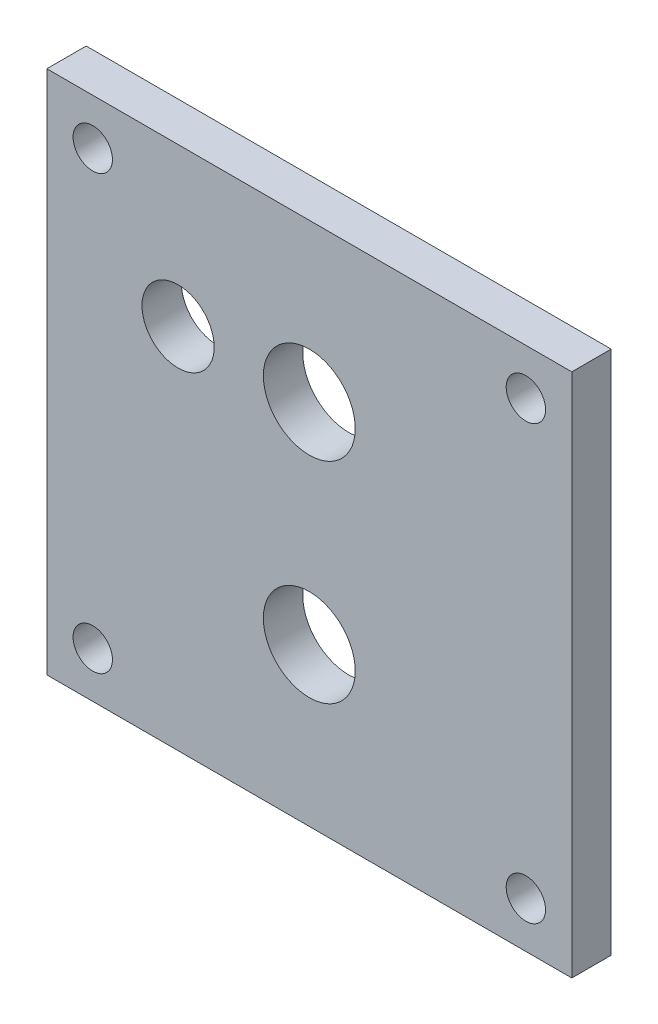
ISO-10303-21;
HEADER;
FILE_DESCRIPTION(('STEP AP214'),'2;1');
FILE_NAME('part.step','',(''),(''),'','','');
FILE_SCHEMA(('AUTOMOTIVE_DESIGN { 1 0 10303 214 1 1 1 1 }'));
ENDSEC;
DATA;
#1=APPLICATION_CONTEXT('core data for automotive mechanical design processes');
#2=APPLICATION_PROTOCOL_DEFINITION('international standard','automotive_design',2000,#1);
#3=PRODUCT_CONTEXT('',#1,'mechanical');
#4=PRODUCT('Part','Part','',(#3));
#5=PRODUCT_RELATED_PRODUCT_CATEGORY('part','',(#4));
#6=PRODUCT_DEFINITION_FORMATION('','',#4);
#7=PRODUCT_DEFINITION_CONTEXT('part definition',#1,'design');
#8=PRODUCT_DEFINITION('design','',#6,#7);
#9=PRODUCT_DEFINITION_SHAPE('','',#8);
#10=(LENGTH_UNIT() NAMED_UNIT(*) SI_UNIT(.MILLI.,.METRE.));
#11=(NAMED_UNIT(*) PLANE_ANGLE_UNIT() SI_UNIT($,.RADIAN.));
#12=(NAMED_UNIT(*) SI_UNIT($,.STERADIAN.) SOLID_ANGLE_UNIT());
#13=UNCERTAINTY_MEASURE_WITH_UNIT(LENGTH_MEASURE(1.E-05),#10,'distance_accuracy_value','');
#14=(GEOMETRIC_REPRESENTATION_CONTEXT(3) GLOBAL_UNCERTAINTY_ASSIGNED_CONTEXT((#13)) GLOBAL_UNIT_ASSIGNED_CONTEXT((#10,
#11,#12)) REPRESENTATION_CONTEXT('',''));
#15=CARTESIAN_POINT('',(0.,0.,0.));
#16=DIRECTION('',(0.,0.,1.));
#17=DIRECTION('',(1.,0.,0.));
#18=AXIS2_PLACEMENT_3D('',#15,#16,#17);
#19=CARTESIAN_POINT('',(63.5,63.5,9.525));
#20=DIRECTION('',(-1.,0.,0.));
#21=DIRECTION('',(0.,-1.,0.));
#22=AXIS2_PLACEMENT_3D('',#19,#20,#21);
#23=PLANE('',#22);
#24=DIRECTION('',(0.,1.,0.));
#25=VECTOR('',#24,1.);
#26=CARTESIAN_POINT('',(63.5,63.5,0.));
#27=LINE('',#26,#25);
#28=CARTESIAN_POINT('',(63.5,-63.5,0.));
#29=VERTEX_POINT('',#28);
#30=CARTESIAN_POINT('',(63.5,63.5,0.));
#31=VERTEX_POINT('',#30);
#32=EDGE_CURVE('E95',#29,#31,#27,.T.);
#33=ORIENTED_EDGE('',*,*,#32,.T.);
#34=DIRECTION('',(0.,0.,-1.));
#35=VECTOR('',#34,1.);
#36=CARTESIAN_POINT('',(63.5,63.5,9.525));
#37=LINE('',#36,#35);
#38=CARTESIAN_POINT('',(63.5,63.5,9.525));
#39=VERTEX_POINT('',#38);
#40=EDGE_CURVE('E11',#39,#31,#37,.T.);
#41=ORIENTED_EDGE('',*,*,#40,.F.);
#42=DIRECTION('',(0.,1.,0.));
#43=VECTOR('',#42,1.);
#44=CARTESIAN_POINT('',(63.5,63.5,9.525));
#45=LINE('',#44,#43);
#46=CARTESIAN_POINT('',(63.5,-63.5,9.525));
#47=VERTEX_POINT('',#46);
#48=EDGE_CURVE('E83',#47,#39,#45,.T.);
#49=ORIENTED_EDGE('',*,*,#48,.F.);
#50=DIRECTION('',(0.,0.,-1.));
#51=VECTOR('',#50,1.);
#52=CARTESIAN_POINT('',(63.5,-63.5,9.525));
#53=LINE('',#52,#51);
#54=EDGE_CURVE('E91',#47,#29,#53,.T.);
#55=ORIENTED_EDGE('',*,*,#54,.T.);
#56=EDGE_LOOP('',(#33,#41,#49,#55));
#57=FACE_BOUND('',#56,.T.);
#58=ADVANCED_FACE('F32',(#57),#23,.F.);
#59=CARTESIAN_POINT('',(-63.5,63.5,9.525));
#60=DIRECTION('',(0.,-1.,0.));
#61=DIRECTION('',(0.,0.,-1.));
#62=AXIS2_PLACEMENT_3D('',#59,#60,#61);
#63=PLANE('',#62);
#64=DIRECTION('',(-1.,0.,0.));
#65=VECTOR('',#64,1.);
#66=CARTESIAN_POINT('',(-63.5,63.5,0.));
#67=LINE('',#66,#65);
#68=CARTESIAN_POINT('',(-63.5,63.5,0.));
#69=VERTEX_POINT('',#68);
#70=EDGE_CURVE('E87',#31,#69,#67,.T.);
#71=ORIENTED_EDGE('',*,*,#70,.T.);
#72=DIRECTION('',(0.,0.,-1.));
#73=VECTOR('',#72,1.);
#74=CARTESIAN_POINT('',(-63.5,63.5,9.525));
#75=LINE('',#74,#73);
#76=CARTESIAN_POINT('',(-63.5,63.5,9.525));
#77=VERTEX_POINT('',#76);
#78=EDGE_CURVE('E40',#77,#69,#75,.T.);
#79=ORIENTED_EDGE('',*,*,#78,.F.);
#80=DIRECTION('',(-1.,0.,0.));
#81=VECTOR('',#80,1.);
#82=CARTESIAN_POINT('',(-63.5,63.5,9.525));
#83=LINE('',#82,#81);
#84=EDGE_CURVE('E78',#39,#77,#83,.T.);
#85=ORIENTED_EDGE('',*,*,#84,.F.);
#86=ORIENTED_EDGE('',*,*,#40,.T.);
#87=EDGE_LOOP('',(#71,#79,#85,#86));
#88=FACE_BOUND('',#87,.T.);
#89=ADVANCED_FACE('F86',(#88),#63,.F.);
#90=CARTESIAN_POINT('',(-63.5,63.5,9.525));
#91=DIRECTION('',(1.,0.,0.));
#92=DIRECTION('',(0.,1.,0.));
#93=AXIS2_PLACEMENT_3D('',#90,#91,#92);
#94=PLANE('',#93);
#95=DIRECTION('',(0.,-1.,0.));
#96=VECTOR('',#95,1.);
#97=CARTESIAN_POINT('',(-63.5,63.5,0.));
#98=LINE('',#97,#96);
#99=CARTESIAN_POINT('',(-63.5,-63.5,0.));
#100=VERTEX_POINT('',#99);
#101=EDGE_CURVE('E65',#69,#100,#98,.T.);
#102=ORIENTED_EDGE('',*,*,#101,.T.);
#103=DIRECTION('',(0.,0.,-1.));
#104=VECTOR('',#103,1.);
#105=CARTESIAN_POINT('',(-63.5,-63.5,9.525));
#106=LINE('',#105,#104);
#107=CARTESIAN_POINT('',(-63.5,-63.5,9.525));
#108=VERTEX_POINT('',#107);
#109=EDGE_CURVE('E88',#108,#100,#106,.T.);
#110=ORIENTED_EDGE('',*,*,#109,.F.);
#111=DIRECTION('',(0.,-1.,0.));
#112=VECTOR('',#111,1.);
#113=CARTESIAN_POINT('',(-63.5,63.5,9.525));
#114=LINE('',#113,#112);
#115=EDGE_CURVE('E81',#77,#108,#114,.T.);
#116=ORIENTED_EDGE('',*,*,#115,.F.);
#117=ORIENTED_EDGE('',*,*,#78,.T.);
#118=EDGE_LOOP('',(#102,#110,#116,#117));
#119=FACE_BOUND('',#118,.T.);
#120=ADVANCED_FACE('F89',(#119),#94,.F.);
#121=CARTESIAN_POINT('',(-63.5,-63.5,9.525));
#122=DIRECTION('',(0.,1.,0.));
#123=DIRECTION('',(0.,0.,1.));
#124=AXIS2_PLACEMENT_3D('',#121,#122,#123);
#125=PLANE('',#124);
#126=DIRECTION('',(1.,0.,0.));
#127=VECTOR('',#126,1.);
#128=CARTESIAN_POINT('',(-63.5,-63.5,0.));
#129=LINE('',#128,#127);
#130=EDGE_CURVE('E71',#100,#29,#129,.T.);
#131=ORIENTED_EDGE('',*,*,#130,.T.);
#132=ORIENTED_EDGE('',*,*,#54,.F.);
#133=DIRECTION('',(1.,0.,0.));
#134=VECTOR('',#133,1.);
#135=CARTESIAN_POINT('',(-63.5,-63.5,9.525));
#136=LINE('',#135,#134);
#137=EDGE_CURVE('E48',#108,#47,#136,.T.);
#138=ORIENTED_EDGE('',*,*,#137,.F.);
#139=ORIENTED_EDGE('',*,*,#109,.T.);
#140=EDGE_LOOP('',(#131,#132,#138,#139));
#141=FACE_BOUND('',#140,.T.);
#142=ADVANCED_FACE('F103',(#141),#125,.F.);
#143=CARTESIAN_POINT('',(0.,0.,9.525));
#144=DIRECTION('',(0.,0.,1.));
#145=DIRECTION('',(1.,0.,0.));
#146=AXIS2_PLACEMENT_3D('',#143,#144,#145);
#147=PLANE('',#146);
#148=CARTESIAN_POINT('',(52.3875,-52.3875,9.525));
#149=DIRECTION('',(0.,0.,1.));
#150=DIRECTION('',(1.,0.,0.));
#151=AXIS2_PLACEMENT_3D('',#148,#149,#150);
#152=CIRCLE('',#151,4.7625);
#153=CARTESIAN_POINT('',(47.625,-52.3875,9.525));
#154=VERTEX_POINT('',#153);
#155=EDGE_CURVE('E144',#154,#154,#152,.F.);
#156=ORIENTED_EDGE('',*,*,#155,.T.);
#157=EDGE_LOOP('',(#156));
#158=FACE_BOUND('',#157,.T.);
#159=CARTESIAN_POINT('',(52.3875,52.3875,9.525));
#160=DIRECTION('',(0.,0.,1.));
#161=DIRECTION('',(1.,0.,0.));
#162=AXIS2_PLACEMENT_3D('',#159,#160,#161);
#163=CIRCLE('',#162,4.7625);
#164=CARTESIAN_POINT('',(47.625,52.3875,9.525));
#165=VERTEX_POINT('',#164);
#166=EDGE_CURVE('E138',#165,#165,#163,.F.);
#167=ORIENTED_EDGE('',*,*,#166,.T.);
#168=EDGE_LOOP('',(#167));
#169=FACE_BOUND('',#168,.T.);
#170=CARTESIAN_POINT('',(-52.3875,-52.3875,9.525));
#171=DIRECTION('',(0.,0.,1.));
#172=DIRECTION('',(1.,0.,0.));
#173=AXIS2_PLACEMENT_3D('',#170,#171,#172);
#174=CIRCLE('',#173,4.7625);
#175=CARTESIAN_POINT('',(-57.15,-52.3875,9.525));
#176=VERTEX_POINT('',#175);
#177=EDGE_CURVE('E132',#176,#176,#174,.F.);
#178=ORIENTED_EDGE('',*,*,#177,.T.);
#179=EDGE_LOOP('',(#178));
#180=FACE_BOUND('',#179,.T.);
#181=CARTESIAN_POINT('',(-52.3875,52.3875,9.525));
#182=DIRECTION('',(0.,0.,1.));
#183=DIRECTION('',(1.,0.,0.));
#184=AXIS2_PLACEMENT_3D('',#181,#182,#183);
#185=CIRCLE('',#184,4.7625);
#186=CARTESIAN_POINT('',(-57.15,52.3875,9.525));
#187=VERTEX_POINT('',#186);
#188=EDGE_CURVE('E126',#187,#187,#185,.F.);
#189=ORIENTED_EDGE('',*,*,#188,.T.);
#190=EDGE_LOOP('',(#189));
#191=FACE_BOUND('',#190,.T.);
#192=CARTESIAN_POINT('',(0.,-25.4,9.525));
#193=DIRECTION('',(0.,0.,1.));
#194=DIRECTION('',(1.,0.,0.));
#195=AXIS2_PLACEMENT_3D('',#192,#193,#194);
#196=CIRCLE('',#195,11.1125);
#197=CARTESIAN_POINT('',(11.1125,-25.4,9.525));
#198=VERTEX_POINT('',#197);
#199=EDGE_CURVE('E120',#198,#198,#196,.F.);
#200=ORIENTED_EDGE('',*,*,#199,.T.);
#201=EDGE_LOOP('',(#200));
#202=FACE_BOUND('',#201,.T.);
#203=CARTESIAN_POINT('',(-31.75,25.4,9.525));
#204=DIRECTION('',(0.,0.,1.));
#205=DIRECTION('',(1.,0.,0.));
#206=AXIS2_PLACEMENT_3D('',#203,#204,#205);
#207=CIRCLE('',#206,8.73124999999999);
#208=CARTESIAN_POINT('',(-23.01875,25.4,9.525));
#209=VERTEX_POINT('',#208);
#210=EDGE_CURVE('E114',#209,#209,#207,.F.);
#211=ORIENTED_EDGE('',*,*,#210,.T.);
#212=EDGE_LOOP('',(#211));
#213=FACE_BOUND('',#212,.T.);
#214=CARTESIAN_POINT('',(0.,25.4,9.525));
#215=DIRECTION('',(0.,0.,1.));
#216=DIRECTION('',(1.,0.,0.));
#217=AXIS2_PLACEMENT_3D('',#214,#215,#216);
#218=CIRCLE('',#217,11.1125);
#219=CARTESIAN_POINT('',(11.1125,25.4,9.525));
#220=VERTEX_POINT('',#219);
#221=EDGE_CURVE('E98',#220,#220,#218,.F.);
#222=ORIENTED_EDGE('',*,*,#221,.T.);
#223=EDGE_LOOP('',(#222));
#224=FACE_BOUND('',#223,.T.);
#225=ORIENTED_EDGE('',*,*,#48,.T.);
#226=ORIENTED_EDGE('',*,*,#84,.T.);
#227=ORIENTED_EDGE('',*,*,#115,.T.);
#228=ORIENTED_EDGE('',*,*,#137,.T.);
#229=EDGE_LOOP('',(#225,#226,#227,#228));
#230=FACE_BOUND('',#229,.T.);
#231=ADVANCED_FACE('F79',(#158,#169,#180,#191,#202,#213,#224,#230),#147,.T.);
#232=CARTESIAN_POINT('',(0.,0.,0.));
#233=DIRECTION('',(0.,0.,1.));
#234=DIRECTION('',(1.,0.,0.));
#235=AXIS2_PLACEMENT_3D('',#232,#233,#234);
#236=PLANE('',#235);
#237=CARTESIAN_POINT('',(52.3875,-52.3875,0.));
#238=DIRECTION('',(0.,0.,-1.));
#239=DIRECTION('',(-1.,0.,0.));
#240=AXIS2_PLACEMENT_3D('',#237,#238,#239);
#241=CIRCLE('',#240,4.7625);
#242=CARTESIAN_POINT('',(47.625,-52.3875,0.));
#243=VERTEX_POINT('',#242);
#244=EDGE_CURVE('E147',#243,#243,#241,.T.);
#245=ORIENTED_EDGE('',*,*,#244,.F.);
#246=EDGE_LOOP('',(#245));
#247=FACE_BOUND('',#246,.T.);
#248=CARTESIAN_POINT('',(52.3875,52.3875,0.));
#249=DIRECTION('',(0.,0.,-1.));
#250=DIRECTION('',(1.,0.,0.));
#251=AXIS2_PLACEMENT_3D('',#248,#249,#250);
#252=CIRCLE('',#251,4.7625);
#253=CARTESIAN_POINT('',(47.625,52.3875,0.));
#254=VERTEX_POINT('',#253);
#255=EDGE_CURVE('E141',#254,#254,#252,.T.);
#256=ORIENTED_EDGE('',*,*,#255,.F.);
#257=EDGE_LOOP('',(#256));
#258=FACE_BOUND('',#257,.T.);
#259=CARTESIAN_POINT('',(-52.3875,-52.3875,0.));
#260=DIRECTION('',(0.,0.,-1.));
#261=DIRECTION('',(1.,0.,0.));
#262=AXIS2_PLACEMENT_3D('',#259,#260,#261);
#263=CIRCLE('',#262,4.7625);
#264=CARTESIAN_POINT('',(-57.15,-52.3875,0.));
#265=VERTEX_POINT('',#264);
#266=EDGE_CURVE('E135',#265,#265,#263,.T.);
#267=ORIENTED_EDGE('',*,*,#266,.F.);
#268=EDGE_LOOP('',(#267));
#269=FACE_BOUND('',#268,.T.);
#270=CARTESIAN_POINT('',(-52.3875,52.3875,0.));
#271=DIRECTION('',(0.,0.,-1.));
#272=DIRECTION('',(-1.,0.,0.));
#273=AXIS2_PLACEMENT_3D('',#270,#271,#272);
#274=CIRCLE('',#273,4.7625);
#275=CARTESIAN_POINT('',(-57.15,52.3875,0.));
#276=VERTEX_POINT('',#275);
#277=EDGE_CURVE('E129',#276,#276,#274,.T.);
#278=ORIENTED_EDGE('',*,*,#277,.F.);
#279=EDGE_LOOP('',(#278));
#280=FACE_BOUND('',#279,.T.);
#281=CARTESIAN_POINT('',(0.,-25.4,0.));
#282=DIRECTION('',(0.,0.,-1.));
#283=DIRECTION('',(-1.,0.,0.));
#284=AXIS2_PLACEMENT_3D('',#281,#282,#283);
#285=CIRCLE('',#284,11.1125);
#286=CARTESIAN_POINT('',(-11.1125,-25.4,0.));
#287=VERTEX_POINT('',#286);
#288=EDGE_CURVE('E123',#287,#287,#285,.T.);
#289=ORIENTED_EDGE('',*,*,#288,.F.);
#290=EDGE_LOOP('',(#289));
#291=FACE_BOUND('',#290,.T.);
#292=CARTESIAN_POINT('',(-31.75,25.4,0.));
#293=DIRECTION('',(0.,0.,-1.));
#294=DIRECTION('',(-1.,0.,0.));
#295=AXIS2_PLACEMENT_3D('',#292,#293,#294);
#296=CIRCLE('',#295,8.73124999999999);
#297=CARTESIAN_POINT('',(-40.48125,25.4,0.));
#298=VERTEX_POINT('',#297);
#299=EDGE_CURVE('E117',#298,#298,#296,.T.);
#300=ORIENTED_EDGE('',*,*,#299,.F.);
#301=EDGE_LOOP('',(#300));
#302=FACE_BOUND('',#301,.T.);
#303=CARTESIAN_POINT('',(0.,25.4,0.));
#304=DIRECTION('',(0.,0.,-1.));
#305=DIRECTION('',(-1.,0.,0.));
#306=AXIS2_PLACEMENT_3D('',#303,#304,#305);
#307=CIRCLE('',#306,11.1125);
#308=CARTESIAN_POINT('',(-11.1125,25.4,0.));
#309=VERTEX_POINT('',#308);
#310=EDGE_CURVE('E111',#309,#309,#307,.T.);
#311=ORIENTED_EDGE('',*,*,#310,.F.);
#312=EDGE_LOOP('',(#311));
#313=FACE_BOUND('',#312,.T.);
#314=ORIENTED_EDGE('',*,*,#32,.F.);
#315=ORIENTED_EDGE('',*,*,#130,.F.);
#316=ORIENTED_EDGE('',*,*,#101,.F.);
#317=ORIENTED_EDGE('',*,*,#70,.F.);
#318=EDGE_LOOP('',(#314,#315,#316,#317));
#319=FACE_BOUND('',#318,.T.);
#320=ADVANCED_FACE('F106',(#247,#258,#269,#280,#291,#302,#313,#319),#236,.F.);
#321=CARTESIAN_POINT('',(0.,25.4,40.955896423742));
#322=DIRECTION('',(0.,0.,-1.));
#323=DIRECTION('',(-1.,0.,0.));
#324=AXIS2_PLACEMENT_3D('',#321,#322,#323);
#325=CYLINDRICAL_SURFACE('',#324,11.1125);
#326=ORIENTED_EDGE('',*,*,#310,.T.);
#327=EDGE_LOOP('',(#326));
#328=FACE_BOUND('',#327,.T.);
#329=ORIENTED_EDGE('',*,*,#221,.F.);
#330=EDGE_LOOP('',(#329));
#331=FACE_BOUND('',#330,.T.);
#332=ADVANCED_FACE('F156',(#328,#331),#325,.F.);
#333=CARTESIAN_POINT('',(-31.75,25.4,40.955896423742));
#334=DIRECTION('',(0.,0.,-1.));
#335=DIRECTION('',(-1.,0.,0.));
#336=AXIS2_PLACEMENT_3D('',#333,#334,#335);
#337=CYLINDRICAL_SURFACE('',#336,8.73124999999999);
#338=ORIENTED_EDGE('',*,*,#299,.T.);
#339=EDGE_LOOP('',(#338));
#340=FACE_BOUND('',#339,.T.);
#341=ORIENTED_EDGE('',*,*,#210,.F.);
#342=EDGE_LOOP('',(#341));
#343=FACE_BOUND('',#342,.T.);
#344=ADVANCED_FACE('F172',(#340,#343),#337,.F.);
#345=CARTESIAN_POINT('',(0.,-25.4,40.955896423742));
#346=DIRECTION('',(0.,0.,-1.));
#347=DIRECTION('',(-1.,0.,0.));
#348=AXIS2_PLACEMENT_3D('',#345,#346,#347);
#349=CYLINDRICAL_SURFACE('',#348,11.1125);
#350=ORIENTED_EDGE('',*,*,#288,.T.);
#351=EDGE_LOOP('',(#350));
#352=FACE_BOUND('',#351,.T.);
#353=ORIENTED_EDGE('',*,*,#199,.F.);
#354=EDGE_LOOP('',(#353));
#355=FACE_BOUND('',#354,.T.);
#356=ADVANCED_FACE('F215',(#352,#355),#349,.F.);
#357=CARTESIAN_POINT('',(-52.3875,52.3875,22.9953841816037));
#358=DIRECTION('',(0.,0.,-1.));
#359=DIRECTION('',(-1.,0.,0.));
#360=AXIS2_PLACEMENT_3D('',#357,#358,#359);
#361=CYLINDRICAL_SURFACE('',#360,4.7625);
#362=CARTESIAN_POINT('',(-57.15,52.3875,0.));
#363=CARTESIAN_POINT('',(-57.15,52.3875,0.0992187500000035));
#364=CARTESIAN_POINT('',(-57.15,52.3875,0.198437500000004));
#365=CARTESIAN_POINT('',(-57.15,52.3875,0.396875000000004));
#366=CARTESIAN_POINT('',(-57.15,52.3875,0.496093750000004));
#367=CARTESIAN_POINT('',(-57.15,52.3875,0.694531250000004));
#368=CARTESIAN_POINT('',(-57.15,52.3875,0.793750000000004));
#369=CARTESIAN_POINT('',(-57.15,52.3875,0.992187500000004));
#370=CARTESIAN_POINT('',(-57.15,52.3875,1.09140625));
#371=CARTESIAN_POINT('',(-57.15,52.3875,1.28984375));
#372=CARTESIAN_POINT('',(-57.15,52.3875,1.3890625));
#373=CARTESIAN_POINT('',(-57.15,52.3875,1.5875));
#374=CARTESIAN_POINT('',(-57.15,52.3875,1.68671875));
#375=CARTESIAN_POINT('',(-57.15,52.3875,1.88515625));
#376=CARTESIAN_POINT('',(-57.15,52.3875,1.984375));
#377=CARTESIAN_POINT('',(-57.15,52.3875,2.1828125));
#378=CARTESIAN_POINT('',(-57.15,52.3875,2.28203125000001));
#379=CARTESIAN_POINT('',(-57.15,52.3875,2.48046875));
#380=CARTESIAN_POINT('',(-57.15,52.3875,2.57968750000001));
#381=CARTESIAN_POINT('',(-57.15,52.3875,2.778125));
#382=CARTESIAN_POINT('',(-57.15,52.3875,2.87734375));
#383=CARTESIAN_POINT('',(-57.15,52.3875,3.07578125));
#384=CARTESIAN_POINT('',(-57.15,52.3875,3.175));
#385=CARTESIAN_POINT('',(-57.15,52.3875,3.3734375));
#386=CARTESIAN_POINT('',(-57.15,52.3875,3.47265625));
#387=CARTESIAN_POINT('',(-57.15,52.3875,3.67109375));
#388=CARTESIAN_POINT('',(-57.15,52.3875,3.7703125));
#389=CARTESIAN_POINT('',(-57.15,52.3875,3.96875));
#390=CARTESIAN_POINT('',(-57.15,52.3875,4.06796875));
#391=CARTESIAN_POINT('',(-57.15,52.3875,4.26640625));
#392=CARTESIAN_POINT('',(-57.15,52.3875,4.365625));
#393=CARTESIAN_POINT('',(-57.15,52.3875,4.5640625));
#394=CARTESIAN_POINT('',(-57.15,52.3875,4.66328125));
#395=CARTESIAN_POINT('',(-57.15,52.3875,4.86171875));
#396=CARTESIAN_POINT('',(-57.15,52.3875,4.9609375));
#397=CARTESIAN_POINT('',(-57.15,52.3875,5.159375));
#398=CARTESIAN_POINT('',(-57.15,52.3875,5.25859375));
#399=CARTESIAN_POINT('',(-57.15,52.3875,5.45703125));
#400=CARTESIAN_POINT('',(-57.15,52.3875,5.55625));
#401=CARTESIAN_POINT('',(-57.15,52.3875,5.7546875));
#402=CARTESIAN_POINT('',(-57.15,52.3875,5.85390625));
#403=CARTESIAN_POINT('',(-57.15,52.3875,6.05234375));
#404=CARTESIAN_POINT('',(-57.15,52.3875,6.1515625));
#405=CARTESIAN_POINT('',(-57.15,52.3875,6.35));
#406=CARTESIAN_POINT('',(-57.15,52.3875,6.44921875));
#407=CARTESIAN_POINT('',(-57.15,52.3875,6.64765625));
#408=CARTESIAN_POINT('',(-57.15,52.3875,6.746875));
#409=CARTESIAN_POINT('',(-57.15,52.3875,6.9453125));
#410=CARTESIAN_POINT('',(-57.15,52.3875,7.04453125));
#411=CARTESIAN_POINT('',(-57.15,52.3875,7.24296875));
#412=CARTESIAN_POINT('',(-57.15,52.3875,7.3421875));
#413=CARTESIAN_POINT('',(-57.15,52.3875,7.540625));
#414=CARTESIAN_POINT('',(-57.15,52.3875,7.63984375));
#415=CARTESIAN_POINT('',(-57.15,52.3875,7.83828125));
#416=CARTESIAN_POINT('',(-57.15,52.3875,7.9375));
#417=CARTESIAN_POINT('',(-57.15,52.3875,8.1359375));
#418=CARTESIAN_POINT('',(-57.15,52.3875,8.23515625));
#419=CARTESIAN_POINT('',(-57.15,52.3875,8.43359375));
#420=CARTESIAN_POINT('',(-57.15,52.3875,8.5328125));
#421=CARTESIAN_POINT('',(-57.15,52.3875,8.73125));
#422=CARTESIAN_POINT('',(-57.15,52.3875,8.83046875));
#423=CARTESIAN_POINT('',(-57.15,52.3875,9.02890625));
#424=CARTESIAN_POINT('',(-57.15,52.3875,9.128125));
#425=CARTESIAN_POINT('',(-57.15,52.3875,9.3265625));
#426=CARTESIAN_POINT('',(-57.15,52.3875,9.42578125));
#427=CARTESIAN_POINT('',(-57.15,52.3875,9.525));
#428=B_SPLINE_CURVE_WITH_KNOTS('',3,(#362,#363,#364,#365,#366,#367,#368,#369,#370,#371,#372,
#373,#374,#375,#376,#377,#378,#379,#380,#381,#382,#383,#384,#385,#386,#387,#388,#389,#390,#391,
#392,#393,#394,#395,#396,#397,#398,#399,#400,#401,#402,#403,#404,#405,#406,#407,#408,#409,#410,
#411,#412,#413,#414,#415,#416,#417,#418,#419,#420,#421,#422,#423,#424,#425,#426,#427),
.UNSPECIFIED.,.F.,.F.,(4,2,2,2,2,2,2,2,2,2,2,2,2,2,2,2,2,2,2,2,2,2,2,2,2,2,2,2,2,2,2,2,4),(0.,
0.29765625,0.5953125,0.892968750000001,1.190625,1.48828125,1.7859375,2.08359375,2.38125,
2.67890625,2.9765625,3.27421875,3.571875,3.86953125,4.1671875,4.46484375,4.7625,5.06015625,
5.3578125,5.65546875,5.953125,6.25078125,6.5484375,6.84609375,7.14375,7.44140625,7.7390625,
8.03671875,8.334375,8.63203125,8.9296875,9.22734375,9.525),.UNSPECIFIED.);
#429=EDGE_CURVE('BSEAM224',#276,#187,#428,.T.);
#430=ORIENTED_EDGE('',*,*,#277,.T.);
#431=ORIENTED_EDGE('',*,*,#188,.F.);
#432=ORIENTED_EDGE('',*,*,#429,.T.);
#433=ORIENTED_EDGE('',*,*,#429,.F.);
#434=EDGE_LOOP('',(#430,#432,#431,#433));
#435=FACE_BOUND('',#434,.T.);
#436=ADVANCED_FACE('F224',(#435),#361,.F.);
#437=CARTESIAN_POINT('',(-52.3875,-52.3875,22.9953841816037));
#438=DIRECTION('',(0.,0.,-1.));
#439=DIRECTION('',(-1.,0.,0.));
#440=AXIS2_PLACEMENT_3D('',#437,#438,#439);
#441=CYLINDRICAL_SURFACE('',#440,4.7625);
#442=CARTESIAN_POINT('',(-57.15,-52.3875,0.));
#443=CARTESIAN_POINT('',(-57.15,-52.3875,0.0992187500000035));
#444=CARTESIAN_POINT('',(-57.15,-52.3875,0.198437500000004));
#445=CARTESIAN_POINT('',(-57.15,-52.3875,0.396875000000004));
#446=CARTESIAN_POINT('',(-57.15,-52.3875,0.496093750000004));
#447=CARTESIAN_POINT('',(-57.15,-52.3875,0.694531250000004));
#448=CARTESIAN_POINT('',(-57.15,-52.3875,0.793750000000004));
#449=CARTESIAN_POINT('',(-57.15,-52.3875,0.992187500000004));
#450=CARTESIAN_POINT('',(-57.15,-52.3875,1.09140625));
#451=CARTESIAN_POINT('',(-57.15,-52.3875,1.28984375));
#452=CARTESIAN_POINT('',(-57.15,-52.3875,1.3890625));
#453=CARTESIAN_POINT('',(-57.15,-52.3875,1.5875));
#454=CARTESIAN_POINT('',(-57.15,-52.3875,1.68671875));
#455=CARTESIAN_POINT('',(-57.15,-52.3875,1.88515625));
#456=CARTESIAN_POINT('',(-57.15,-52.3875,1.984375));
#457=CARTESIAN_POINT('',(-57.15,-52.3875,2.1828125));
#458=CARTESIAN_POINT('',(-57.15,-52.3875,2.28203125000001));
#459=CARTESIAN_POINT('',(-57.15,-52.3875,2.48046875));
#460=CARTESIAN_POINT('',(-57.15,-52.3875,2.57968750000001));
#461=CARTESIAN_POINT('',(-57.15,-52.3875,2.778125));
#462=CARTESIAN_POINT('',(-57.15,-52.3875,2.87734375));
#463=CARTESIAN_POINT('',(-57.15,-52.3875,3.07578125));
#464=CARTESIAN_POINT('',(-57.15,-52.3875,3.175));
#465=CARTESIAN_POINT('',(-57.15,-52.3875,3.3734375));
#466=CARTESIAN_POINT('',(-57.15,-52.3875,3.47265625));
#467=CARTESIAN_POINT('',(-57.15,-52.3875,3.67109375));
#468=CARTESIAN_POINT('',(-57.15,-52.3875,3.7703125));
#469=CARTESIAN_POINT('',(-57.15,-52.3875,3.96875));
#470=CARTESIAN_POINT('',(-57.15,-52.3875,4.06796875));
#471=CARTESIAN_POINT('',(-57.15,-52.3875,4.26640625));
#472=CARTESIAN_POINT('',(-57.15,-52.3875,4.365625));
#473=CARTESIAN_POINT('',(-57.15,-52.3875,4.5640625));
#474=CARTESIAN_POINT('',(-57.15,-52.3875,4.66328125));
#475=CARTESIAN_POINT('',(-57.15,-52.3875,4.86171875));
#476=CARTESIAN_POINT('',(-57.15,-52.3875,4.9609375));
#477=CARTESIAN_POINT('',(-57.15,-52.3875,5.159375));
#478=CARTESIAN_POINT('',(-57.15,-52.3875,5.25859375));
#479=CARTESIAN_POINT('',(-57.15,-52.3875,5.45703125));
#480=CARTESIAN_POINT('',(-57.15,-52.3875,5.55625));
#481=CARTESIAN_POINT('',(-57.15,-52.3875,5.7546875));
#482=CARTESIAN_POINT('',(-57.15,-52.3875,5.85390625));
#483=CARTESIAN_POINT('',(-57.15,-52.3875,6.05234375));
#484=CARTESIAN_POINT('',(-57.15,-52.3875,6.1515625));
#485=CARTESIAN_POINT('',(-57.15,-52.3875,6.35));
#486=CARTESIAN_POINT('',(-57.15,-52.3875,6.44921875));
#487=CARTESIAN_POINT('',(-57.15,-52.3875,6.64765625));
#488=CARTESIAN_POINT('',(-57.15,-52.3875,6.746875));
#489=CARTESIAN_POINT('',(-57.15,-52.3875,6.9453125));
#490=CARTESIAN_POINT('',(-57.15,-52.3875,7.04453125));
#491=CARTESIAN_POINT('',(-57.15,-52.3875,7.24296875));
#492=CARTESIAN_POINT('',(-57.15,-52.3875,7.3421875));
#493=CARTESIAN_POINT('',(-57.15,-52.3875,7.540625));
#494=CARTESIAN_POINT('',(-57.15,-52.3875,7.63984375));
#495=CARTESIAN_POINT('',(-57.15,-52.3875,7.83828125));
#496=CARTESIAN_POINT('',(-57.15,-52.3875,7.9375));
#497=CARTESIAN_POINT('',(-57.15,-52.3875,8.1359375));
#498=CARTESIAN_POINT('',(-57.15,-52.3875,8.23515625));
#499=CARTESIAN_POINT('',(-57.15,-52.3875,8.43359375));
#500=CARTESIAN_POINT('',(-57.15,-52.3875,8.5328125));
#501=CARTESIAN_POINT('',(-57.15,-52.3875,8.73125));
#502=CARTESIAN_POINT('',(-57.15,-52.3875,8.83046875));
#503=CARTESIAN_POINT('',(-57.15,-52.3875,9.02890625));
#504=CARTESIAN_POINT('',(-57.15,-52.3875,9.128125));
#505=CARTESIAN_POINT('',(-57.15,-52.3875,9.3265625));
#506=CARTESIAN_POINT('',(-57.15,-52.3875,9.42578125));
#507=CARTESIAN_POINT('',(-57.15,-52.3875,9.525));
#508=B_SPLINE_CURVE_WITH_KNOTS('',3,(#442,#443,#444,#445,#446,#447,#448,#449,#450,#451,#452,
#453,#454,#455,#456,#457,#458,#459,#460,#461,#462,#463,#464,#465,#466,#467,#468,#469,#470,#471,
#472,#473,#474,#475,#476,#477,#478,#479,#480,#481,#482,#483,#484,#485,#486,#487,#488,#489,#490,
#491,#492,#493,#494,#495,#496,#497,#498,#499,#500,#501,#502,#503,#504,#505,#506,#507),
.UNSPECIFIED.,.F.,.F.,(4,2,2,2,2,2,2,2,2,2,2,2,2,2,2,2,2,2,2,2,2,2,2,2,2,2,2,2,2,2,2,2,4),(0.,
0.29765625,0.5953125,0.892968750000001,1.190625,1.48828125,1.7859375,2.08359375,2.38125,
2.67890625,2.9765625,3.27421875,3.571875,3.86953125,4.1671875,4.46484375,4.7625,5.06015625,
5.3578125,5.65546875,5.953125,6.25078125,6.5484375,6.84609375,7.14375,7.44140625,7.7390625,
8.03671875,8.334375,8.63203125,8.9296875,9.22734375,9.525),.UNSPECIFIED.);
#509=EDGE_CURVE('BSEAM243',#265,#176,#508,.T.);
#510=ORIENTED_EDGE('',*,*,#266,.T.);
#511=ORIENTED_EDGE('',*,*,#177,.F.);
#512=ORIENTED_EDGE('',*,*,#509,.T.);
#513=ORIENTED_EDGE('',*,*,#509,.F.);
#514=EDGE_LOOP('',(#510,#512,#511,#513));
#515=FACE_BOUND('',#514,.T.);
#516=ADVANCED_FACE('F243',(#515),#441,.F.);
#517=CARTESIAN_POINT('',(52.3875,52.3875,22.9953841816037));
#518=DIRECTION('',(0.,0.,-1.));
#519=DIRECTION('',(-1.,0.,0.));
#520=AXIS2_PLACEMENT_3D('',#517,#518,#519);
#521=CYLINDRICAL_SURFACE('',#520,4.7625);
#522=CARTESIAN_POINT('',(47.625,52.3875,0.));
#523=CARTESIAN_POINT('',(47.625,52.3875,0.0992187500000035));
#524=CARTESIAN_POINT('',(47.625,52.3875,0.198437500000004));
#525=CARTESIAN_POINT('',(47.625,52.3875,0.396875000000004));
#526=CARTESIAN_POINT('',(47.625,52.3875,0.496093750000004));
#527=CARTESIAN_POINT('',(47.625,52.3875,0.694531250000004));
#528=CARTESIAN_POINT('',(47.625,52.3875,0.793750000000004));
#529=CARTESIAN_POINT('',(47.625,52.3875,0.992187500000004));
#530=CARTESIAN_POINT('',(47.625,52.3875,1.09140625));
#531=CARTESIAN_POINT('',(47.625,52.3875,1.28984375));
#532=CARTESIAN_POINT('',(47.625,52.3875,1.3890625));
#533=CARTESIAN_POINT('',(47.625,52.3875,1.5875));
#534=CARTESIAN_POINT('',(47.625,52.3875,1.68671875));
#535=CARTESIAN_POINT('',(47.625,52.3875,1.88515625));
#536=CARTESIAN_POINT('',(47.625,52.3875,1.984375));
#537=CARTESIAN_POINT('',(47.625,52.3875,2.1828125));
#538=CARTESIAN_POINT('',(47.625,52.3875,2.28203125000001));
#539=CARTESIAN_POINT('',(47.625,52.3875,2.48046875));
#540=CARTESIAN_POINT('',(47.625,52.3875,2.57968750000001));
#541=CARTESIAN_POINT('',(47.625,52.3875,2.778125));
#542=CARTESIAN_POINT('',(47.625,52.3875,2.87734375));
#543=CARTESIAN_POINT('',(47.625,52.3875,3.07578125));
#544=CARTESIAN_POINT('',(47.625,52.3875,3.175));
#545=CARTESIAN_POINT('',(47.625,52.3875,3.3734375));
#546=CARTESIAN_POINT('',(47.625,52.3875,3.47265625));
#547=CARTESIAN_POINT('',(47.625,52.3875,3.67109375));
#548=CARTESIAN_POINT('',(47.625,52.3875,3.7703125));
#549=CARTESIAN_POINT('',(47.625,52.3875,3.96875));
#550=CARTESIAN_POINT('',(47.625,52.3875,4.06796875));
#551=CARTESIAN_POINT('',(47.625,52.3875,4.26640625));
#552=CARTESIAN_POINT('',(47.625,52.3875,4.365625));
#553=CARTESIAN_POINT('',(47.625,52.3875,4.5640625));
#554=CARTESIAN_POINT('',(47.625,52.3875,4.66328125));
#555=CARTESIAN_POINT('',(47.625,52.3875,4.86171875));
#556=CARTESIAN_POINT('',(47.625,52.3875,4.9609375));
#557=CARTESIAN_POINT('',(47.625,52.3875,5.159375));
#558=CARTESIAN_POINT('',(47.625,52.3875,5.25859375));
#559=CARTESIAN_POINT('',(47.625,52.3875,5.45703125));
#560=CARTESIAN_POINT('',(47.625,52.3875,5.55625));
#561=CARTESIAN_POINT('',(47.625,52.3875,5.7546875));
#562=CARTESIAN_POINT('',(47.625,52.3875,5.85390625));
#563=CARTESIAN_POINT('',(47.625,52.3875,6.05234375));
#564=CARTESIAN_POINT('',(47.625,52.3875,6.1515625));
#565=CARTESIAN_POINT('',(47.625,52.3875,6.35));
#566=CARTESIAN_POINT('',(47.625,52.3875,6.44921875));
#567=CARTESIAN_POINT('',(47.625,52.3875,6.64765625));
#568=CARTESIAN_POINT('',(47.625,52.3875,6.746875));
#569=CARTESIAN_POINT('',(47.625,52.3875,6.9453125));
#570=CARTESIAN_POINT('',(47.625,52.3875,7.04453125));
#571=CARTESIAN_POINT('',(47.625,52.3875,7.24296875));
#572=CARTESIAN_POINT('',(47.625,52.3875,7.3421875));
#573=CARTESIAN_POINT('',(47.625,52.3875,7.540625));
#574=CARTESIAN_POINT('',(47.625,52.3875,7.63984375));
#575=CARTESIAN_POINT('',(47.625,52.3875,7.83828125));
#576=CARTESIAN_POINT('',(47.625,52.3875,7.9375));
#577=CARTESIAN_POINT('',(47.625,52.3875,8.1359375));
#578=CARTESIAN_POINT('',(47.625,52.3875,8.23515625));
#579=CARTESIAN_POINT('',(47.625,52.3875,8.43359375));
#580=CARTESIAN_POINT('',(47.625,52.3875,8.5328125));
#581=CARTESIAN_POINT('',(47.625,52.3875,8.73125));
#582=CARTESIAN_POINT('',(47.625,52.3875,8.83046875));
#583=CARTESIAN_POINT('',(47.625,52.3875,9.02890625));
#584=CARTESIAN_POINT('',(47.625,52.3875,9.128125));
#585=CARTESIAN_POINT('',(47.625,52.3875,9.3265625));
#586=CARTESIAN_POINT('',(47.625,52.3875,9.42578125));
#587=CARTESIAN_POINT('',(47.625,52.3875,9.525));
#588=B_SPLINE_CURVE_WITH_KNOTS('',3,(#522,#523,#524,#525,#526,#527,#528,#529,#530,#531,#532,
#533,#534,#535,#536,#537,#538,#539,#540,#541,#542,#543,#544,#545,#546,#547,#548,#549,#550,#551,
#552,#553,#554,#555,#556,#557,#558,#559,#560,#561,#562,#563,#564,#565,#566,#567,#568,#569,#570,
#571,#572,#573,#574,#575,#576,#577,#578,#579,#580,#581,#582,#583,#584,#585,#586,#587),
.UNSPECIFIED.,.F.,.F.,(4,2,2,2,2,2,2,2,2,2,2,2,2,2,2,2,2,2,2,2,2,2,2,2,2,2,2,2,2,2,2,2,4),(0.,
0.29765625,0.5953125,0.892968750000001,1.190625,1.48828125,1.7859375,2.08359375,2.38125,
2.67890625,2.9765625,3.27421875,3.571875,3.86953125,4.1671875,4.46484375,4.7625,5.06015625,
5.3578125,5.65546875,5.953125,6.25078125,6.5484375,6.84609375,7.14375,7.44140625,7.7390625,
8.03671875,8.334375,8.63203125,8.9296875,9.22734375,9.525),.UNSPECIFIED.);
#589=EDGE_CURVE('BSEAM253',#254,#165,#588,.T.);
#590=ORIENTED_EDGE('',*,*,#255,.T.);
#591=ORIENTED_EDGE('',*,*,#166,.F.);
#592=ORIENTED_EDGE('',*,*,#589,.T.);
#593=ORIENTED_EDGE('',*,*,#589,.F.);
#594=EDGE_LOOP('',(#590,#592,#591,#593));
#595=FACE_BOUND('',#594,.T.);
#596=ADVANCED_FACE('F253',(#595),#521,.F.);
#597=CARTESIAN_POINT('',(52.3875,-52.3875,22.9953841816037));
#598=DIRECTION('',(0.,0.,-1.));
#599=DIRECTION('',(-1.,0.,0.));
#600=AXIS2_PLACEMENT_3D('',#597,#598,#599);
#601=CYLINDRICAL_SURFACE('',#600,4.7625);
#602=CARTESIAN_POINT('',(47.625,-52.3875,0.));
#603=CARTESIAN_POINT('',(47.625,-52.3875,0.0992187500000035));
#604=CARTESIAN_POINT('',(47.625,-52.3875,0.198437500000004));
#605=CARTESIAN_POINT('',(47.625,-52.3875,0.396875000000004));
#606=CARTESIAN_POINT('',(47.625,-52.3875,0.496093750000004));
#607=CARTESIAN_POINT('',(47.625,-52.3875,0.694531250000004));
#608=CARTESIAN_POINT('',(47.625,-52.3875,0.793750000000004));
#609=CARTESIAN_POINT('',(47.625,-52.3875,0.992187500000004));
#610=CARTESIAN_POINT('',(47.625,-52.3875,1.09140625));
#611=CARTESIAN_POINT('',(47.625,-52.3875,1.28984375));
#612=CARTESIAN_POINT('',(47.625,-52.3875,1.3890625));
#613=CARTESIAN_POINT('',(47.625,-52.3875,1.5875));
#614=CARTESIAN_POINT('',(47.625,-52.3875,1.68671875));
#615=CARTESIAN_POINT('',(47.625,-52.3875,1.88515625));
#616=CARTESIAN_POINT('',(47.625,-52.3875,1.984375));
#617=CARTESIAN_POINT('',(47.625,-52.3875,2.1828125));
#618=CARTESIAN_POINT('',(47.625,-52.3875,2.28203125000001));
#619=CARTESIAN_POINT('',(47.625,-52.3875,2.48046875));
#620=CARTESIAN_POINT('',(47.625,-52.3875,2.57968750000001));
#621=CARTESIAN_POINT('',(47.625,-52.3875,2.778125));
#622=CARTESIAN_POINT('',(47.625,-52.3875,2.87734375));
#623=CARTESIAN_POINT('',(47.625,-52.3875,3.07578125));
#624=CARTESIAN_POINT('',(47.625,-52.3875,3.175));
#625=CARTESIAN_POINT('',(47.625,-52.3875,3.3734375));
#626=CARTESIAN_POINT('',(47.625,-52.3875,3.47265625));
#627=CARTESIAN_POINT('',(47.625,-52.3875,3.67109375));
#628=CARTESIAN_POINT('',(47.625,-52.3875,3.7703125));
#629=CARTESIAN_POINT('',(47.625,-52.3875,3.96875));
#630=CARTESIAN_POINT('',(47.625,-52.3875,4.06796875));
#631=CARTESIAN_POINT('',(47.625,-52.3875,4.26640625));
#632=CARTESIAN_POINT('',(47.625,-52.3875,4.365625));
#633=CARTESIAN_POINT('',(47.625,-52.3875,4.5640625));
#634=CARTESIAN_POINT('',(47.625,-52.3875,4.66328125));
#635=CARTESIAN_POINT('',(47.625,-52.3875,4.86171875));
#636=CARTESIAN_POINT('',(47.625,-52.3875,4.9609375));
#637=CARTESIAN_POINT('',(47.625,-52.3875,5.159375));
#638=CARTESIAN_POINT('',(47.625,-52.3875,5.25859375));
#639=CARTESIAN_POINT('',(47.625,-52.3875,5.45703125));
#640=CARTESIAN_POINT('',(47.625,-52.3875,5.55625));
#641=CARTESIAN_POINT('',(47.625,-52.3875,5.7546875));
#642=CARTESIAN_POINT('',(47.625,-52.3875,5.85390625));
#643=CARTESIAN_POINT('',(47.625,-52.3875,6.05234375));
#644=CARTESIAN_POINT('',(47.625,-52.3875,6.1515625));
#645=CARTESIAN_POINT('',(47.625,-52.3875,6.35));
#646=CARTESIAN_POINT('',(47.625,-52.3875,6.44921875));
#647=CARTESIAN_POINT('',(47.625,-52.3875,6.64765625));
#648=CARTESIAN_POINT('',(47.625,-52.3875,6.746875));
#649=CARTESIAN_POINT('',(47.625,-52.3875,6.9453125));
#650=CARTESIAN_POINT('',(47.625,-52.3875,7.04453125));
#651=CARTESIAN_POINT('',(47.625,-52.3875,7.24296875));
#652=CARTESIAN_POINT('',(47.625,-52.3875,7.3421875));
#653=CARTESIAN_POINT('',(47.625,-52.3875,7.540625));
#654=CARTESIAN_POINT('',(47.625,-52.3875,7.63984375));
#655=CARTESIAN_POINT('',(47.625,-52.3875,7.83828125));
#656=CARTESIAN_POINT('',(47.625,-52.3875,7.9375));
#657=CARTESIAN_POINT('',(47.625,-52.3875,8.1359375));
#658=CARTESIAN_POINT('',(47.625,-52.3875,8.23515625));
#659=CARTESIAN_POINT('',(47.625,-52.3875,8.43359375));
#660=CARTESIAN_POINT('',(47.625,-52.3875,8.5328125));
#661=CARTESIAN_POINT('',(47.625,-52.3875,8.73125));
#662=CARTESIAN_POINT('',(47.625,-52.3875,8.83046875));
#663=CARTESIAN_POINT('',(47.625,-52.3875,9.02890625));
#664=CARTESIAN_POINT('',(47.625,-52.3875,9.128125));
#665=CARTESIAN_POINT('',(47.625,-52.3875,9.3265625));
#666=CARTESIAN_POINT('',(47.625,-52.3875,9.42578125));
#667=CARTESIAN_POINT('',(47.625,-52.3875,9.525));
#668=B_SPLINE_CURVE_WITH_KNOTS('',3,(#602,#603,#604,#605,#606,#607,#608,#609,#610,#611,#612,
#613,#614,#615,#616,#617,#618,#619,#620,#621,#622,#623,#624,#625,#626,#627,#628,#629,#630,#631,
#632,#633,#634,#635,#636,#637,#638,#639,#640,#641,#642,#643,#644,#645,#646,#647,#648,#649,#650,
#651,#652,#653,#654,#655,#656,#657,#658,#659,#660,#661,#662,#663,#664,#665,#666,#667),
.UNSPECIFIED.,.F.,.F.,(4,2,2,2,2,2,2,2,2,2,2,2,2,2,2,2,2,2,2,2,2,2,2,2,2,2,2,2,2,2,2,2,4),(0.,
0.29765625,0.5953125,0.892968750000001,1.190625,1.48828125,1.7859375,2.08359375,2.38125,
2.67890625,2.9765625,3.27421875,3.571875,3.86953125,4.1671875,4.46484375,4.7625,5.06015625,
5.3578125,5.65546875,5.953125,6.25078125,6.5484375,6.84609375,7.14375,7.44140625,7.7390625,
8.03671875,8.334375,8.63203125,8.9296875,9.22734375,9.525),.UNSPECIFIED.);
#669=EDGE_CURVE('BSEAM151',#243,#154,#668,.T.);
#670=ORIENTED_EDGE('',*,*,#244,.T.);
#671=ORIENTED_EDGE('',*,*,#155,.F.);
#672=ORIENTED_EDGE('',*,*,#669,.T.);
#673=ORIENTED_EDGE('',*,*,#669,.F.);
#674=EDGE_LOOP('',(#670,#672,#671,#673));
#675=FACE_BOUND('',#674,.T.);
#676=ADVANCED_FACE('F151',(#675),#601,.F.);
#677=CLOSED_SHELL('',(#58,#89,#120,#142,#231,#320,#332,#344,#356,#436,#516,#596,#676));
#678=MANIFOLD_SOLID_BREP('B2',#677);
#679=ADVANCED_BREP_SHAPE_REPRESENTATION('',(#18,#678),#14);
#680=SHAPE_DEFINITION_REPRESENTATION(#9,#679);
ENDSEC;
END-ISO-10303-21;
